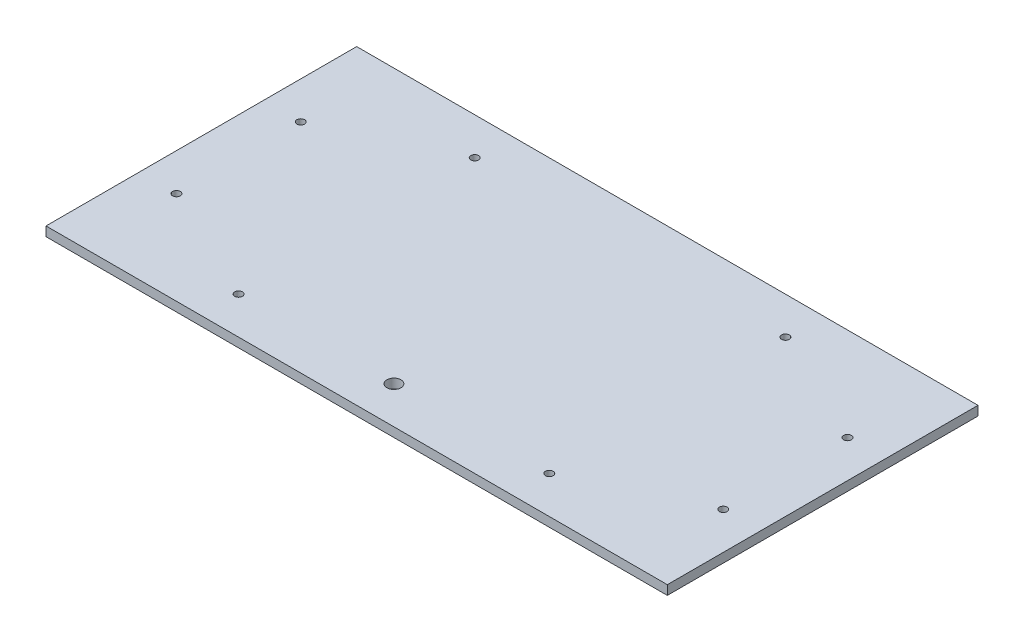
ISO-10303-21;
HEADER;
FILE_DESCRIPTION(('STEP AP214'),'2;1');
FILE_NAME('part.step','',(''),(''),'','','');
FILE_SCHEMA(('AUTOMOTIVE_DESIGN { 1 0 10303 214 1 1 1 1 }'));
ENDSEC;
DATA;
#1=APPLICATION_CONTEXT('core data for automotive mechanical design processes');
#2=APPLICATION_PROTOCOL_DEFINITION('international standard','automotive_design',2000,#1);
#3=PRODUCT_CONTEXT('',#1,'mechanical');
#4=PRODUCT('Part','Part','',(#3));
#5=PRODUCT_RELATED_PRODUCT_CATEGORY('part','',(#4));
#6=PRODUCT_DEFINITION_FORMATION('','',#4);
#7=PRODUCT_DEFINITION_CONTEXT('part definition',#1,'design');
#8=PRODUCT_DEFINITION('design','',#6,#7);
#9=PRODUCT_DEFINITION_SHAPE('','',#8);
#10=(LENGTH_UNIT() NAMED_UNIT(*) SI_UNIT(.MILLI.,.METRE.));
#11=(NAMED_UNIT(*) PLANE_ANGLE_UNIT() SI_UNIT($,.RADIAN.));
#12=(NAMED_UNIT(*) SI_UNIT($,.STERADIAN.) SOLID_ANGLE_UNIT());
#13=UNCERTAINTY_MEASURE_WITH_UNIT(LENGTH_MEASURE(1.E-05),#10,'distance_accuracy_value','');
#14=(GEOMETRIC_REPRESENTATION_CONTEXT(3) GLOBAL_UNCERTAINTY_ASSIGNED_CONTEXT((#13)) GLOBAL_UNIT_ASSIGNED_CONTEXT((#10,
#11,#12)) REPRESENTATION_CONTEXT('',''));
#15=CARTESIAN_POINT('',(0.,0.,0.));
#16=DIRECTION('',(0.,0.,1.));
#17=DIRECTION('',(1.,0.,0.));
#18=AXIS2_PLACEMENT_3D('',#15,#16,#17);
#19=CARTESIAN_POINT('',(200.,6.00000000000001,100.000000000002));
#20=DIRECTION('',(-1.,0.,0.));
#21=DIRECTION('',(0.,0.,1.00000000000001));
#22=AXIS2_PLACEMENT_3D('',#19,#20,#21);
#23=PLANE('',#22);
#24=DIRECTION('',(0.,0.,-1.00000000000001));
#25=VECTOR('',#24,1.);
#26=CARTESIAN_POINT('',(200.,0.,100.000000000002));
#27=LINE('',#26,#25);
#28=CARTESIAN_POINT('',(200.,0.,100.000000000002));
#29=VERTEX_POINT('',#28);
#30=CARTESIAN_POINT('',(200.,0.,-100.000000000001));
#31=VERTEX_POINT('',#30);
#32=EDGE_CURVE('E116',#29,#31,#27,.T.);
#33=ORIENTED_EDGE('',*,*,#32,.T.);
#34=DIRECTION('',(0.,-1.00000000000001,0.));
#35=VECTOR('',#34,1.);
#36=CARTESIAN_POINT('',(200.,6.00000000000001,-100.000000000001));
#37=LINE('',#36,#35);
#38=CARTESIAN_POINT('',(200.,6.00000000000001,-100.000000000001));
#39=VERTEX_POINT('',#38);
#40=EDGE_CURVE('E11',#39,#31,#37,.T.);
#41=ORIENTED_EDGE('',*,*,#40,.F.);
#42=DIRECTION('',(0.,0.,-1.00000000000001));
#43=VECTOR('',#42,1.);
#44=CARTESIAN_POINT('',(200.,6.00000000000001,100.000000000002));
#45=LINE('',#44,#43);
#46=CARTESIAN_POINT('',(200.,6.00000000000001,100.000000000002));
#47=VERTEX_POINT('',#46);
#48=EDGE_CURVE('E99',#47,#39,#45,.T.);
#49=ORIENTED_EDGE('',*,*,#48,.F.);
#50=DIRECTION('',(0.,-1.00000000000001,0.));
#51=VECTOR('',#50,1.);
#52=CARTESIAN_POINT('',(200.,6.00000000000001,100.000000000002));
#53=LINE('',#52,#51);
#54=EDGE_CURVE('E112',#47,#29,#53,.T.);
#55=ORIENTED_EDGE('',*,*,#54,.T.);
#56=EDGE_LOOP('',(#33,#41,#49,#55));
#57=FACE_BOUND('',#56,.T.);
#58=ADVANCED_FACE('F47',(#57),#23,.F.);
#59=CARTESIAN_POINT('',(-200.,6.00000000000001,-100.000000000001));
#60=DIRECTION('',(0.,0.,1.00000000000001));
#61=DIRECTION('',(1.,0.,0.));
#62=AXIS2_PLACEMENT_3D('',#59,#60,#61);
#63=PLANE('',#62);
#64=DIRECTION('',(-1.,0.,0.));
#65=VECTOR('',#64,1.);
#66=CARTESIAN_POINT('',(-200.,0.,-100.000000000001));
#67=LINE('',#66,#65);
#68=CARTESIAN_POINT('',(-200.,0.,-100.000000000001));
#69=VERTEX_POINT('',#68);
#70=EDGE_CURVE('E104',#31,#69,#67,.T.);
#71=ORIENTED_EDGE('',*,*,#70,.T.);
#72=DIRECTION('',(0.,-1.00000000000001,0.));
#73=VECTOR('',#72,1.);
#74=CARTESIAN_POINT('',(-200.,6.00000000000001,-100.000000000001));
#75=LINE('',#74,#73);
#76=CARTESIAN_POINT('',(-200.,6.00000000000001,-100.000000000001));
#77=VERTEX_POINT('',#76);
#78=EDGE_CURVE('E56',#77,#69,#75,.T.);
#79=ORIENTED_EDGE('',*,*,#78,.F.);
#80=DIRECTION('',(-1.,0.,0.));
#81=VECTOR('',#80,1.);
#82=CARTESIAN_POINT('',(-200.,6.00000000000001,-100.000000000001));
#83=LINE('',#82,#81);
#84=EDGE_CURVE('E94',#39,#77,#83,.T.);
#85=ORIENTED_EDGE('',*,*,#84,.F.);
#86=ORIENTED_EDGE('',*,*,#40,.T.);
#87=EDGE_LOOP('',(#71,#79,#85,#86));
#88=FACE_BOUND('',#87,.T.);
#89=ADVANCED_FACE('F103',(#88),#63,.F.);
#90=CARTESIAN_POINT('',(-200.,6.00000000000001,100.000000000002));
#91=DIRECTION('',(1.,0.,0.));
#92=DIRECTION('',(0.,0.,-1.00000000000001));
#93=AXIS2_PLACEMENT_3D('',#90,#91,#92);
#94=PLANE('',#93);
#95=DIRECTION('',(0.,0.,1.00000000000001));
#96=VECTOR('',#95,1.);
#97=CARTESIAN_POINT('',(-200.,0.,100.000000000002));
#98=LINE('',#97,#96);
#99=CARTESIAN_POINT('',(-200.,0.,100.000000000002));
#100=VERTEX_POINT('',#99);
#101=EDGE_CURVE('E81',#69,#100,#98,.T.);
#102=ORIENTED_EDGE('',*,*,#101,.T.);
#103=DIRECTION('',(0.,-1.00000000000001,0.));
#104=VECTOR('',#103,1.);
#105=CARTESIAN_POINT('',(-200.,6.00000000000001,100.000000000002));
#106=LINE('',#105,#104);
#107=CARTESIAN_POINT('',(-200.,6.00000000000001,100.000000000002));
#108=VERTEX_POINT('',#107);
#109=EDGE_CURVE('E106',#108,#100,#106,.T.);
#110=ORIENTED_EDGE('',*,*,#109,.F.);
#111=DIRECTION('',(0.,0.,1.00000000000001));
#112=VECTOR('',#111,1.);
#113=CARTESIAN_POINT('',(-200.,6.00000000000001,100.000000000002));
#114=LINE('',#113,#112);
#115=EDGE_CURVE('E97',#77,#108,#114,.T.);
#116=ORIENTED_EDGE('',*,*,#115,.F.);
#117=ORIENTED_EDGE('',*,*,#78,.T.);
#118=EDGE_LOOP('',(#102,#110,#116,#117));
#119=FACE_BOUND('',#118,.T.);
#120=ADVANCED_FACE('F107',(#119),#94,.F.);
#121=CARTESIAN_POINT('',(-200.,6.00000000000001,100.000000000002));
#122=DIRECTION('',(0.,0.,-1.00000000000001));
#123=DIRECTION('',(-1.,0.,0.));
#124=AXIS2_PLACEMENT_3D('',#121,#122,#123);
#125=PLANE('',#124);
#126=DIRECTION('',(1.,0.,0.));
#127=VECTOR('',#126,1.);
#128=CARTESIAN_POINT('',(-200.,0.,100.000000000002));
#129=LINE('',#128,#127);
#130=EDGE_CURVE('E87',#100,#29,#129,.T.);
#131=ORIENTED_EDGE('',*,*,#130,.T.);
#132=ORIENTED_EDGE('',*,*,#54,.F.);
#133=DIRECTION('',(1.,0.,0.));
#134=VECTOR('',#133,1.);
#135=CARTESIAN_POINT('',(-200.,6.00000000000001,100.000000000002));
#136=LINE('',#135,#134);
#137=EDGE_CURVE('E64',#108,#47,#136,.T.);
#138=ORIENTED_EDGE('',*,*,#137,.F.);
#139=ORIENTED_EDGE('',*,*,#109,.T.);
#140=EDGE_LOOP('',(#131,#132,#138,#139));
#141=FACE_BOUND('',#140,.T.);
#142=ADVANCED_FACE('F131',(#141),#125,.F.);
#143=CARTESIAN_POINT('',(0.,6.00000000000001,0.));
#144=DIRECTION('',(0.,-1.00000000000001,0.));
#145=DIRECTION('',(0.,0.,-1.00000000000001));
#146=AXIS2_PLACEMENT_3D('',#143,#144,#145);
#147=PLANE('',#146);
#148=CARTESIAN_POINT('',(0.,6.00000000000087,76.0000000000015));
#149=DIRECTION('',(0.,1.00000000000001,0.));
#150=DIRECTION('',(0.,0.,1.00000000000001));
#151=AXIS2_PLACEMENT_3D('',#148,#149,#150);
#152=CIRCLE('',#151,4.5);
#153=CARTESIAN_POINT('',(0.,6.00000000000087,80.5000000000016));
#154=VERTEX_POINT('',#153);
#155=EDGE_CURVE('E203',#154,#154,#152,.T.);
#156=ORIENTED_EDGE('',*,*,#155,.F.);
#157=EDGE_LOOP('',(#156));
#158=FACE_BOUND('',#157,.T.);
#159=CARTESIAN_POINT('',(100.,6.00000000000001,-76.0000000000009));
#160=DIRECTION('',(0.,1.00000000000001,0.));
#161=DIRECTION('',(0.,0.,1.00000000000001));
#162=AXIS2_PLACEMENT_3D('',#159,#160,#161);
#163=CIRCLE('',#162,2.5);
#164=CARTESIAN_POINT('',(100.,6.00000000000001,-73.5000000000009));
#165=VERTEX_POINT('',#164);
#166=EDGE_CURVE('E143',#165,#165,#163,.T.);
#167=ORIENTED_EDGE('',*,*,#166,.F.);
#168=EDGE_LOOP('',(#167));
#169=FACE_BOUND('',#168,.T.);
#170=CARTESIAN_POINT('',(100.,6.00000000000087,76.0000000000015));
#171=DIRECTION('',(0.,1.00000000000001,0.));
#172=DIRECTION('',(0.,0.,1.00000000000001));
#173=AXIS2_PLACEMENT_3D('',#170,#171,#172);
#174=CIRCLE('',#173,2.5);
#175=CARTESIAN_POINT('',(100.,6.00000000000087,78.5000000000015));
#176=VERTEX_POINT('',#175);
#177=EDGE_CURVE('E168',#176,#176,#174,.T.);
#178=ORIENTED_EDGE('',*,*,#177,.F.);
#179=EDGE_LOOP('',(#178));
#180=FACE_BOUND('',#179,.T.);
#181=CARTESIAN_POINT('',(-100.,6.00000000000087,76.0000000000015));
#182=DIRECTION('',(0.,1.00000000000001,0.));
#183=DIRECTION('',(0.,0.,1.00000000000001));
#184=AXIS2_PLACEMENT_3D('',#181,#182,#183);
#185=CIRCLE('',#184,2.5);
#186=CARTESIAN_POINT('',(-100.,6.00000000000087,78.5000000000015));
#187=VERTEX_POINT('',#186);
#188=EDGE_CURVE('E160',#187,#187,#185,.T.);
#189=ORIENTED_EDGE('',*,*,#188,.F.);
#190=EDGE_LOOP('',(#189));
#191=FACE_BOUND('',#190,.T.);
#192=CARTESIAN_POINT('',(-176.,6.00000000000001,40.0000000000009));
#193=DIRECTION('',(0.,1.00000000000001,0.));
#194=DIRECTION('',(0.,0.,1.00000000000001));
#195=AXIS2_PLACEMENT_3D('',#192,#193,#194);
#196=CIRCLE('',#195,2.5);
#197=CARTESIAN_POINT('',(-176.,6.00000000000001,42.5000000000009));
#198=VERTEX_POINT('',#197);
#199=EDGE_CURVE('E151',#198,#198,#196,.T.);
#200=ORIENTED_EDGE('',*,*,#199,.F.);
#201=EDGE_LOOP('',(#200));
#202=FACE_BOUND('',#201,.T.);
#203=CARTESIAN_POINT('',(176.,6.00000000000045,-40.));
#204=DIRECTION('',(0.,1.00000000000001,0.));
#205=DIRECTION('',(0.,0.,1.00000000000001));
#206=AXIS2_PLACEMENT_3D('',#203,#204,#205);
#207=CIRCLE('',#206,2.5);
#208=CARTESIAN_POINT('',(176.,6.00000000000045,-37.5));
#209=VERTEX_POINT('',#208);
#210=EDGE_CURVE('E184',#209,#209,#207,.T.);
#211=ORIENTED_EDGE('',*,*,#210,.F.);
#212=EDGE_LOOP('',(#211));
#213=FACE_BOUND('',#212,.T.);
#214=CARTESIAN_POINT('',(-176.,6.00000000000045,-40.));
#215=DIRECTION('',(0.,1.00000000000001,0.));
#216=DIRECTION('',(0.,0.,1.00000000000001));
#217=AXIS2_PLACEMENT_3D('',#214,#215,#216);
#218=CIRCLE('',#217,2.5);
#219=CARTESIAN_POINT('',(-176.,6.00000000000045,-37.5));
#220=VERTEX_POINT('',#219);
#221=EDGE_CURVE('E183',#220,#220,#218,.T.);
#222=ORIENTED_EDGE('',*,*,#221,.F.);
#223=EDGE_LOOP('',(#222));
#224=FACE_BOUND('',#223,.T.);
#225=CARTESIAN_POINT('',(176.,6.00000000000001,40.0000000000009));
#226=DIRECTION('',(0.,1.00000000000001,0.));
#227=DIRECTION('',(0.,0.,1.00000000000001));
#228=AXIS2_PLACEMENT_3D('',#225,#226,#227);
#229=CIRCLE('',#228,2.5);
#230=CARTESIAN_POINT('',(176.,6.00000000000001,42.5000000000009));
#231=VERTEX_POINT('',#230);
#232=EDGE_CURVE('E152',#231,#231,#229,.T.);
#233=ORIENTED_EDGE('',*,*,#232,.F.);
#234=EDGE_LOOP('',(#233));
#235=FACE_BOUND('',#234,.T.);
#236=CARTESIAN_POINT('',(-100.,6.00000000000001,-76.0000000000009));
#237=DIRECTION('',(0.,1.00000000000001,0.));
#238=DIRECTION('',(0.,0.,1.00000000000001));
#239=AXIS2_PLACEMENT_3D('',#236,#237,#238);
#240=CIRCLE('',#239,2.5);
#241=CARTESIAN_POINT('',(-100.,6.00000000000001,-73.5000000000009));
#242=VERTEX_POINT('',#241);
#243=EDGE_CURVE('E139',#242,#242,#240,.T.);
#244=ORIENTED_EDGE('',*,*,#243,.F.);
#245=EDGE_LOOP('',(#244));
#246=FACE_BOUND('',#245,.T.);
#247=ORIENTED_EDGE('',*,*,#48,.T.);
#248=ORIENTED_EDGE('',*,*,#84,.T.);
#249=ORIENTED_EDGE('',*,*,#115,.T.);
#250=ORIENTED_EDGE('',*,*,#137,.T.);
#251=EDGE_LOOP('',(#247,#248,#249,#250));
#252=FACE_BOUND('',#251,.T.);
#253=ADVANCED_FACE('F95',(#158,#169,#180,#191,#202,#213,#224,#235,#246,#252),#147,.F.);
#254=CARTESIAN_POINT('',(0.,0.,0.));
#255=DIRECTION('',(0.,-1.00000000000001,0.));
#256=DIRECTION('',(0.,0.,-1.00000000000001));
#257=AXIS2_PLACEMENT_3D('',#254,#255,#256);
#258=PLANE('',#257);
#259=CARTESIAN_POINT('',(0.,8.88178419700125E-13,76.0000000000015));
#260=DIRECTION('',(0.,1.00000000000001,0.));
#261=DIRECTION('',(0.,0.,1.00000000000001));
#262=AXIS2_PLACEMENT_3D('',#259,#260,#261);
#263=CIRCLE('',#262,4.5);
#264=CARTESIAN_POINT('',(0.,8.88178419700125E-13,80.5000000000016));
#265=VERTEX_POINT('',#264);
#266=EDGE_CURVE('E199',#265,#265,#263,.T.);
#267=ORIENTED_EDGE('',*,*,#266,.T.);
#268=EDGE_LOOP('',(#267));
#269=FACE_BOUND('',#268,.T.);
#270=CARTESIAN_POINT('',(100.,0.,-76.0000000000009));
#271=DIRECTION('',(0.,1.00000000000001,0.));
#272=DIRECTION('',(0.,0.,1.00000000000001));
#273=AXIS2_PLACEMENT_3D('',#270,#271,#272);
#274=CIRCLE('',#273,2.5);
#275=CARTESIAN_POINT('',(100.,0.,-73.5000000000009));
#276=VERTEX_POINT('',#275);
#277=EDGE_CURVE('E172',#276,#276,#274,.T.);
#278=ORIENTED_EDGE('',*,*,#277,.T.);
#279=EDGE_LOOP('',(#278));
#280=FACE_BOUND('',#279,.T.);
#281=CARTESIAN_POINT('',(100.,8.88178419700125E-13,76.0000000000015));
#282=DIRECTION('',(0.,1.00000000000001,0.));
#283=DIRECTION('',(0.,0.,1.00000000000001));
#284=AXIS2_PLACEMENT_3D('',#281,#282,#283);
#285=CIRCLE('',#284,2.5);
#286=CARTESIAN_POINT('',(100.,8.88178419700125E-13,78.5000000000015));
#287=VERTEX_POINT('',#286);
#288=EDGE_CURVE('E164',#287,#287,#285,.T.);
#289=ORIENTED_EDGE('',*,*,#288,.T.);
#290=EDGE_LOOP('',(#289));
#291=FACE_BOUND('',#290,.T.);
#292=CARTESIAN_POINT('',(-100.,8.88178419700125E-13,76.0000000000015));
#293=DIRECTION('',(0.,1.00000000000001,0.));
#294=DIRECTION('',(0.,0.,1.00000000000001));
#295=AXIS2_PLACEMENT_3D('',#292,#293,#294);
#296=CIRCLE('',#295,2.5);
#297=CARTESIAN_POINT('',(-100.,8.88178419700125E-13,78.5000000000015));
#298=VERTEX_POINT('',#297);
#299=EDGE_CURVE('E156',#298,#298,#296,.T.);
#300=ORIENTED_EDGE('',*,*,#299,.T.);
#301=EDGE_LOOP('',(#300));
#302=FACE_BOUND('',#301,.T.);
#303=CARTESIAN_POINT('',(-176.,0.,40.0000000000009));
#304=DIRECTION('',(0.,1.00000000000001,0.));
#305=DIRECTION('',(0.,0.,1.00000000000001));
#306=AXIS2_PLACEMENT_3D('',#303,#304,#305);
#307=CIRCLE('',#306,2.5);
#308=CARTESIAN_POINT('',(-176.,0.,42.5000000000009));
#309=VERTEX_POINT('',#308);
#310=EDGE_CURVE('E147',#309,#309,#307,.T.);
#311=ORIENTED_EDGE('',*,*,#310,.T.);
#312=EDGE_LOOP('',(#311));
#313=FACE_BOUND('',#312,.T.);
#314=CARTESIAN_POINT('',(176.,4.44089209850063E-13,-40.));
#315=DIRECTION('',(0.,1.00000000000001,0.));
#316=DIRECTION('',(0.,0.,1.00000000000001));
#317=AXIS2_PLACEMENT_3D('',#314,#315,#316);
#318=CIRCLE('',#317,2.5);
#319=CARTESIAN_POINT('',(176.,4.44089209850063E-13,-37.5));
#320=VERTEX_POINT('',#319);
#321=EDGE_CURVE('E195',#320,#320,#318,.T.);
#322=ORIENTED_EDGE('',*,*,#321,.T.);
#323=EDGE_LOOP('',(#322));
#324=FACE_BOUND('',#323,.T.);
#325=CARTESIAN_POINT('',(-176.,4.44089209850063E-13,-40.));
#326=DIRECTION('',(0.,1.00000000000001,0.));
#327=DIRECTION('',(0.,0.,1.00000000000001));
#328=AXIS2_PLACEMENT_3D('',#325,#326,#327);
#329=CIRCLE('',#328,2.5);
#330=CARTESIAN_POINT('',(-176.,4.44089209850063E-13,-37.5));
#331=VERTEX_POINT('',#330);
#332=EDGE_CURVE('E179',#331,#331,#329,.T.);
#333=ORIENTED_EDGE('',*,*,#332,.T.);
#334=EDGE_LOOP('',(#333));
#335=FACE_BOUND('',#334,.T.);
#336=CARTESIAN_POINT('',(176.,0.,40.0000000000009));
#337=DIRECTION('',(0.,1.00000000000001,0.));
#338=DIRECTION('',(0.,0.,1.00000000000001));
#339=AXIS2_PLACEMENT_3D('',#336,#337,#338);
#340=CIRCLE('',#339,2.5);
#341=CARTESIAN_POINT('',(176.,0.,42.5000000000009));
#342=VERTEX_POINT('',#341);
#343=EDGE_CURVE('E188',#342,#342,#340,.T.);
#344=ORIENTED_EDGE('',*,*,#343,.T.);
#345=EDGE_LOOP('',(#344));
#346=FACE_BOUND('',#345,.T.);
#347=CARTESIAN_POINT('',(-100.,0.,-76.0000000000009));
#348=DIRECTION('',(0.,1.00000000000001,0.));
#349=DIRECTION('',(0.,0.,1.00000000000001));
#350=AXIS2_PLACEMENT_3D('',#347,#348,#349);
#351=CIRCLE('',#350,2.5);
#352=CARTESIAN_POINT('',(-100.,0.,-73.5000000000009));
#353=VERTEX_POINT('',#352);
#354=EDGE_CURVE('E120',#353,#353,#351,.T.);
#355=ORIENTED_EDGE('',*,*,#354,.T.);
#356=EDGE_LOOP('',(#355));
#357=FACE_BOUND('',#356,.T.);
#358=ORIENTED_EDGE('',*,*,#32,.F.);
#359=ORIENTED_EDGE('',*,*,#130,.F.);
#360=ORIENTED_EDGE('',*,*,#101,.F.);
#361=ORIENTED_EDGE('',*,*,#70,.F.);
#362=EDGE_LOOP('',(#358,#359,#360,#361));
#363=FACE_BOUND('',#362,.T.);
#364=ADVANCED_FACE('F134',(#269,#280,#291,#302,#313,#324,#335,#346,#357,#363),#258,.T.);
#365=CARTESIAN_POINT('',(-100.,0.,-76.0000000000009));
#366=DIRECTION('',(0.,1.00000000000001,0.));
#367=DIRECTION('',(0.,0.,1.00000000000001));
#368=AXIS2_PLACEMENT_3D('',#365,#366,#367);
#369=CYLINDRICAL_SURFACE('',#368,2.5);
#370=ORIENTED_EDGE('',*,*,#354,.F.);
#371=EDGE_LOOP('',(#370));
#372=FACE_BOUND('',#371,.T.);
#373=ORIENTED_EDGE('',*,*,#243,.T.);
#374=EDGE_LOOP('',(#373));
#375=FACE_BOUND('',#374,.T.);
#376=ADVANCED_FACE('F240',(#372,#375),#369,.F.);
#377=CARTESIAN_POINT('',(176.,0.,40.0000000000009));
#378=DIRECTION('',(0.,1.00000000000001,0.));
#379=DIRECTION('',(0.,0.,1.00000000000001));
#380=AXIS2_PLACEMENT_3D('',#377,#378,#379);
#381=CYLINDRICAL_SURFACE('',#380,2.5);
#382=ORIENTED_EDGE('',*,*,#343,.F.);
#383=EDGE_LOOP('',(#382));
#384=FACE_BOUND('',#383,.T.);
#385=ORIENTED_EDGE('',*,*,#232,.T.);
#386=EDGE_LOOP('',(#385));
#387=FACE_BOUND('',#386,.T.);
#388=ADVANCED_FACE('F242',(#384,#387),#381,.F.);
#389=CARTESIAN_POINT('',(-176.,4.44089209850063E-13,-40.));
#390=DIRECTION('',(0.,1.00000000000001,0.));
#391=DIRECTION('',(0.,0.,1.00000000000001));
#392=AXIS2_PLACEMENT_3D('',#389,#390,#391);
#393=CYLINDRICAL_SURFACE('',#392,2.5);
#394=ORIENTED_EDGE('',*,*,#332,.F.);
#395=EDGE_LOOP('',(#394));
#396=FACE_BOUND('',#395,.T.);
#397=ORIENTED_EDGE('',*,*,#221,.T.);
#398=EDGE_LOOP('',(#397));
#399=FACE_BOUND('',#398,.T.);
#400=ADVANCED_FACE('F249',(#396,#399),#393,.F.);
#401=CARTESIAN_POINT('',(176.,4.44089209850063E-13,-40.));
#402=DIRECTION('',(0.,1.00000000000001,0.));
#403=DIRECTION('',(0.,0.,1.00000000000001));
#404=AXIS2_PLACEMENT_3D('',#401,#402,#403);
#405=CYLINDRICAL_SURFACE('',#404,2.5);
#406=ORIENTED_EDGE('',*,*,#321,.F.);
#407=EDGE_LOOP('',(#406));
#408=FACE_BOUND('',#407,.T.);
#409=ORIENTED_EDGE('',*,*,#210,.T.);
#410=EDGE_LOOP('',(#409));
#411=FACE_BOUND('',#410,.T.);
#412=ADVANCED_FACE('F301',(#408,#411),#405,.F.);
#413=CARTESIAN_POINT('',(-176.,0.,40.0000000000009));
#414=DIRECTION('',(0.,1.00000000000001,0.));
#415=DIRECTION('',(0.,0.,1.00000000000001));
#416=AXIS2_PLACEMENT_3D('',#413,#414,#415);
#417=CYLINDRICAL_SURFACE('',#416,2.5);
#418=ORIENTED_EDGE('',*,*,#310,.F.);
#419=EDGE_LOOP('',(#418));
#420=FACE_BOUND('',#419,.T.);
#421=ORIENTED_EDGE('',*,*,#199,.T.);
#422=EDGE_LOOP('',(#421));
#423=FACE_BOUND('',#422,.T.);
#424=ADVANCED_FACE('F311',(#420,#423),#417,.F.);
#425=CARTESIAN_POINT('',(-100.,8.88178419700125E-13,76.0000000000015));
#426=DIRECTION('',(0.,1.00000000000001,0.));
#427=DIRECTION('',(0.,0.,1.00000000000001));
#428=AXIS2_PLACEMENT_3D('',#425,#426,#427);
#429=CYLINDRICAL_SURFACE('',#428,2.5);
#430=ORIENTED_EDGE('',*,*,#299,.F.);
#431=EDGE_LOOP('',(#430));
#432=FACE_BOUND('',#431,.T.);
#433=ORIENTED_EDGE('',*,*,#188,.T.);
#434=EDGE_LOOP('',(#433));
#435=FACE_BOUND('',#434,.T.);
#436=ADVANCED_FACE('F321',(#432,#435),#429,.F.);
#437=CARTESIAN_POINT('',(100.,8.88178419700125E-13,76.0000000000015));
#438=DIRECTION('',(0.,1.00000000000001,0.));
#439=DIRECTION('',(0.,0.,1.00000000000001));
#440=AXIS2_PLACEMENT_3D('',#437,#438,#439);
#441=CYLINDRICAL_SURFACE('',#440,2.5);
#442=ORIENTED_EDGE('',*,*,#288,.F.);
#443=EDGE_LOOP('',(#442));
#444=FACE_BOUND('',#443,.T.);
#445=ORIENTED_EDGE('',*,*,#177,.T.);
#446=EDGE_LOOP('',(#445));
#447=FACE_BOUND('',#446,.T.);
#448=ADVANCED_FACE('F330',(#444,#447),#441,.F.);
#449=CARTESIAN_POINT('',(100.,0.,-76.0000000000009));
#450=DIRECTION('',(0.,1.00000000000001,0.));
#451=DIRECTION('',(0.,0.,1.00000000000001));
#452=AXIS2_PLACEMENT_3D('',#449,#450,#451);
#453=CYLINDRICAL_SURFACE('',#452,2.5);
#454=ORIENTED_EDGE('',*,*,#277,.F.);
#455=EDGE_LOOP('',(#454));
#456=FACE_BOUND('',#455,.T.);
#457=ORIENTED_EDGE('',*,*,#166,.T.);
#458=EDGE_LOOP('',(#457));
#459=FACE_BOUND('',#458,.T.);
#460=ADVANCED_FACE('F217',(#456,#459),#453,.F.);
#461=CARTESIAN_POINT('',(0.,8.88178419700125E-13,76.0000000000015));
#462=DIRECTION('',(0.,1.00000000000001,0.));
#463=DIRECTION('',(0.,0.,1.00000000000001));
#464=AXIS2_PLACEMENT_3D('',#461,#462,#463);
#465=CYLINDRICAL_SURFACE('',#464,4.5);
#466=ORIENTED_EDGE('',*,*,#266,.F.);
#467=EDGE_LOOP('',(#466));
#468=FACE_BOUND('',#467,.T.);
#469=ORIENTED_EDGE('',*,*,#155,.T.);
#470=EDGE_LOOP('',(#469));
#471=FACE_BOUND('',#470,.T.);
#472=ADVANCED_FACE('F214',(#468,#471),#465,.F.);
#473=CLOSED_SHELL('',(#58,#89,#120,#142,#253,#364,#376,#388,#400,#412,#424,#436,#448,#460,#472));
#474=MANIFOLD_SOLID_BREP('B2',#473);
#475=ADVANCED_BREP_SHAPE_REPRESENTATION('',(#18,#474),#14);
#476=SHAPE_DEFINITION_REPRESENTATION(#9,#475);
ENDSEC;
END-ISO-10303-21;
